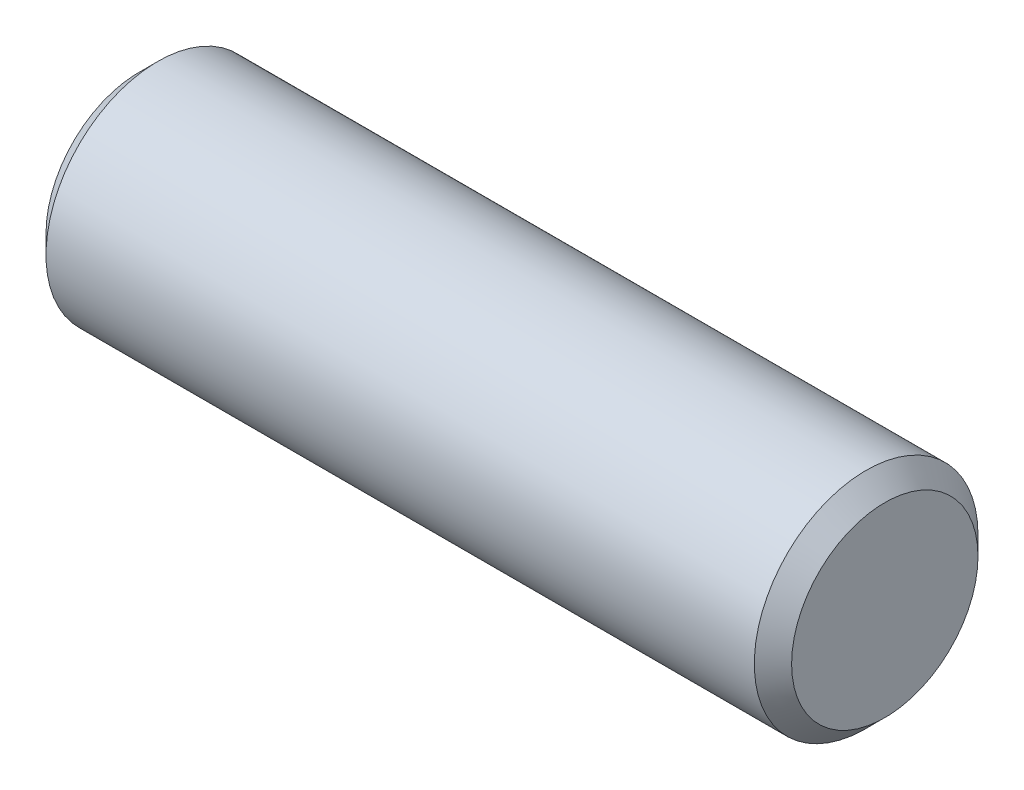
ISO-10303-21;
HEADER;
FILE_DESCRIPTION(('STEP AP214'),'2;1');
FILE_NAME('part.step','',(''),(''),'','','');
FILE_SCHEMA(('AUTOMOTIVE_DESIGN { 1 0 10303 214 1 1 1 1 }'));
ENDSEC;
DATA;
#1=APPLICATION_CONTEXT('core data for automotive mechanical design processes');
#2=APPLICATION_PROTOCOL_DEFINITION('international standard','automotive_design',2000,#1);
#3=PRODUCT_CONTEXT('',#1,'mechanical');
#4=PRODUCT('Part','Part','',(#3));
#5=PRODUCT_RELATED_PRODUCT_CATEGORY('part','',(#4));
#6=PRODUCT_DEFINITION_FORMATION('','',#4);
#7=PRODUCT_DEFINITION_CONTEXT('part definition',#1,'design');
#8=PRODUCT_DEFINITION('design','',#6,#7);
#9=PRODUCT_DEFINITION_SHAPE('','',#8);
#10=(LENGTH_UNIT() NAMED_UNIT(*) SI_UNIT(.MILLI.,.METRE.));
#11=(NAMED_UNIT(*) PLANE_ANGLE_UNIT() SI_UNIT($,.RADIAN.));
#12=(NAMED_UNIT(*) SI_UNIT($,.STERADIAN.) SOLID_ANGLE_UNIT());
#13=UNCERTAINTY_MEASURE_WITH_UNIT(LENGTH_MEASURE(1.E-05),#10,'distance_accuracy_value','');
#14=(GEOMETRIC_REPRESENTATION_CONTEXT(3) GLOBAL_UNCERTAINTY_ASSIGNED_CONTEXT((#13)) GLOBAL_UNIT_ASSIGNED_CONTEXT((#10,
#11,#12)) REPRESENTATION_CONTEXT('',''));
#15=CARTESIAN_POINT('',(0.,0.,0.));
#16=DIRECTION('',(0.,0.,1.));
#17=DIRECTION('',(1.,0.,0.));
#18=AXIS2_PLACEMENT_3D('',#15,#16,#17);
#19=CARTESIAN_POINT('',(10.,0.,0.));
#20=DIRECTION('',(-1.,0.,0.));
#21=DIRECTION('',(0.,0.,1.));
#22=AXIS2_PLACEMENT_3D('',#19,#20,#21);
#23=CYLINDRICAL_SURFACE('',#22,1.5);
#24=CARTESIAN_POINT('',(0.250000000000002,0.,0.));
#25=DIRECTION('',(1.,0.,0.));
#26=DIRECTION('',(0.,0.,-1.));
#27=AXIS2_PLACEMENT_3D('',#24,#25,#26);
#28=CIRCLE('',#27,1.5);
#29=CARTESIAN_POINT('',(0.250000000000002,0.,-1.5));
#30=VERTEX_POINT('',#29);
#31=EDGE_CURVE('E50',#30,#30,#28,.T.);
#32=ORIENTED_EDGE('',*,*,#31,.T.);
#33=EDGE_LOOP('',(#32));
#34=FACE_BOUND('',#33,.T.);
#35=CARTESIAN_POINT('',(9.75,0.,0.));
#36=DIRECTION('',(1.,0.,0.));
#37=DIRECTION('',(0.,0.,-1.));
#38=AXIS2_PLACEMENT_3D('',#35,#36,#37);
#39=CIRCLE('',#38,1.5);
#40=CARTESIAN_POINT('',(9.75,0.,-1.5));
#41=VERTEX_POINT('',#40);
#42=EDGE_CURVE('E55',#41,#41,#39,.F.);
#43=ORIENTED_EDGE('',*,*,#42,.T.);
#44=EDGE_LOOP('',(#43));
#45=FACE_BOUND('',#44,.T.);
#46=ADVANCED_FACE('F37',(#34,#45),#23,.T.);
#47=CARTESIAN_POINT('',(10.,0.,0.));
#48=DIRECTION('',(1.,0.,0.));
#49=DIRECTION('',(0.,0.,-1.));
#50=AXIS2_PLACEMENT_3D('',#47,#48,#49);
#51=PLANE('',#50);
#52=CARTESIAN_POINT('',(10.,0.,0.));
#53=DIRECTION('',(1.,0.,0.));
#54=DIRECTION('',(0.,0.,-1.));
#55=AXIS2_PLACEMENT_3D('',#52,#53,#54);
#56=CIRCLE('',#55,1.25);
#57=CARTESIAN_POINT('',(10.,0.,-1.25));
#58=VERTEX_POINT('',#57);
#59=EDGE_CURVE('E10',#58,#58,#56,.T.);
#60=ORIENTED_EDGE('',*,*,#59,.T.);
#61=EDGE_LOOP('',(#60));
#62=FACE_BOUND('',#61,.T.);
#63=ADVANCED_FACE('F72',(#62),#51,.T.);
#64=CARTESIAN_POINT('',(0.,0.,0.));
#65=DIRECTION('',(1.,0.,0.));
#66=DIRECTION('',(0.,0.,-1.));
#67=AXIS2_PLACEMENT_3D('',#64,#65,#66);
#68=PLANE('',#67);
#69=CARTESIAN_POINT('',(0.,0.,0.));
#70=DIRECTION('',(1.,0.,0.));
#71=DIRECTION('',(0.,0.,-1.));
#72=AXIS2_PLACEMENT_3D('',#69,#70,#71);
#73=CIRCLE('',#72,1.25);
#74=CARTESIAN_POINT('',(0.,0.,-1.25));
#75=VERTEX_POINT('',#74);
#76=EDGE_CURVE('E45',#75,#75,#73,.F.);
#77=ORIENTED_EDGE('',*,*,#76,.T.);
#78=EDGE_LOOP('',(#77));
#79=FACE_BOUND('',#78,.T.);
#80=ADVANCED_FACE('F69',(#79),#68,.F.);
#81=CARTESIAN_POINT('',(0.250000000000002,0.,0.));
#82=DIRECTION('',(1.,0.,0.));
#83=DIRECTION('',(0.,0.,-1.));
#84=AXIS2_PLACEMENT_3D('',#81,#82,#83);
#85=CONICAL_SURFACE('',#84,1.5,0.785398163397453);
#86=ORIENTED_EDGE('',*,*,#76,.F.);
#87=EDGE_LOOP('',(#86));
#88=FACE_BOUND('',#87,.T.);
#89=ORIENTED_EDGE('',*,*,#31,.F.);
#90=EDGE_LOOP('',(#89));
#91=FACE_BOUND('',#90,.T.);
#92=ADVANCED_FACE('F65',(#88,#91),#85,.T.);
#93=CARTESIAN_POINT('',(10.,0.,0.));
#94=DIRECTION('',(-1.,0.,0.));
#95=DIRECTION('',(0.,0.,1.));
#96=AXIS2_PLACEMENT_3D('',#93,#94,#95);
#97=CONICAL_SURFACE('',#96,1.25,0.785398163397445);
#98=ORIENTED_EDGE('',*,*,#42,.F.);
#99=EDGE_LOOP('',(#98));
#100=FACE_BOUND('',#99,.T.);
#101=ORIENTED_EDGE('',*,*,#59,.F.);
#102=EDGE_LOOP('',(#101));
#103=FACE_BOUND('',#102,.T.);
#104=ADVANCED_FACE('F39',(#100,#103),#97,.T.);
#105=CLOSED_SHELL('',(#46,#63,#80,#92,#104));
#106=MANIFOLD_SOLID_BREP('B2',#105);
#107=ADVANCED_BREP_SHAPE_REPRESENTATION('',(#18,#106),#14);
#108=SHAPE_DEFINITION_REPRESENTATION(#9,#107);
ENDSEC;
END-ISO-10303-21;
